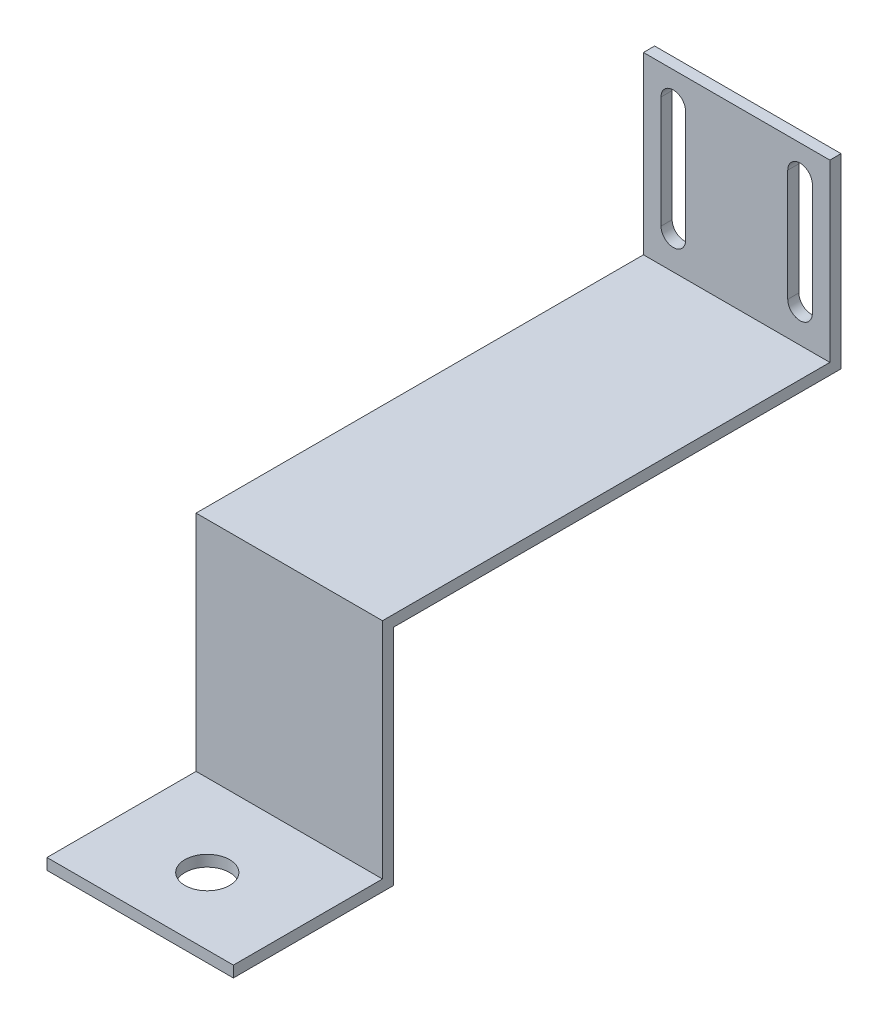
ISO-10303-21;
HEADER;
FILE_DESCRIPTION(('STEP AP214'),'2;1');
FILE_NAME('part.step','',(''),(''),'','','');
FILE_SCHEMA(('AUTOMOTIVE_DESIGN { 1 0 10303 214 1 1 1 1 }'));
ENDSEC;
DATA;
#1=APPLICATION_CONTEXT('core data for automotive mechanical design processes');
#2=APPLICATION_PROTOCOL_DEFINITION('international standard','automotive_design',2000,#1);
#3=PRODUCT_CONTEXT('',#1,'mechanical');
#4=PRODUCT('Part','Part','',(#3));
#5=PRODUCT_RELATED_PRODUCT_CATEGORY('part','',(#4));
#6=PRODUCT_DEFINITION_FORMATION('','',#4);
#7=PRODUCT_DEFINITION_CONTEXT('part definition',#1,'design');
#8=PRODUCT_DEFINITION('design','',#6,#7);
#9=PRODUCT_DEFINITION_SHAPE('','',#8);
#10=(LENGTH_UNIT() NAMED_UNIT(*) SI_UNIT(.MILLI.,.METRE.));
#11=(NAMED_UNIT(*) PLANE_ANGLE_UNIT() SI_UNIT($,.RADIAN.));
#12=(NAMED_UNIT(*) SI_UNIT($,.STERADIAN.) SOLID_ANGLE_UNIT());
#13=UNCERTAINTY_MEASURE_WITH_UNIT(LENGTH_MEASURE(1.E-05),#10,'distance_accuracy_value','');
#14=(GEOMETRIC_REPRESENTATION_CONTEXT(3) GLOBAL_UNCERTAINTY_ASSIGNED_CONTEXT((#13)) GLOBAL_UNIT_ASSIGNED_CONTEXT((#10,
#11,#12)) REPRESENTATION_CONTEXT('',''));
#15=CARTESIAN_POINT('',(0.,0.,0.));
#16=DIRECTION('',(0.,0.,1.));
#17=DIRECTION('',(1.,0.,0.));
#18=AXIS2_PLACEMENT_3D('',#15,#16,#17);
#19=CARTESIAN_POINT('',(0.,0.,123.));
#20=DIRECTION('',(0.,0.,-1.));
#21=DIRECTION('',(-1.,0.,0.));
#22=AXIS2_PLACEMENT_3D('',#19,#20,#21);
#23=PLANE('',#22);
#24=DIRECTION('',(-1.,0.,0.));
#25=VECTOR('',#24,1.);
#26=CARTESIAN_POINT('',(-25.,-82.,123.));
#27=LINE('',#26,#25);
#28=CARTESIAN_POINT('',(25.,-82.,123.));
#29=VERTEX_POINT('',#28);
#30=CARTESIAN_POINT('',(-25.,-82.,123.));
#31=VERTEX_POINT('',#30);
#32=EDGE_CURVE('E219',#29,#31,#27,.T.);
#33=ORIENTED_EDGE('',*,*,#32,.F.);
#34=DIRECTION('',(0.,1.,0.));
#35=VECTOR('',#34,1.);
#36=CARTESIAN_POINT('',(25.,-25.,123.));
#37=LINE('',#36,#35);
#38=CARTESIAN_POINT('',(25.,-22.,123.));
#39=VERTEX_POINT('',#38);
#40=EDGE_CURVE('E239',#29,#39,#37,.T.);
#41=ORIENTED_EDGE('',*,*,#40,.T.);
#42=DIRECTION('',(-1.,0.,0.));
#43=VECTOR('',#42,1.);
#44=CARTESIAN_POINT('',(-25.,-22.,123.));
#45=LINE('',#44,#43);
#46=CARTESIAN_POINT('',(-25.,-22.,123.));
#47=VERTEX_POINT('',#46);
#48=EDGE_CURVE('E356',#39,#47,#45,.T.);
#49=ORIENTED_EDGE('',*,*,#48,.T.);
#50=DIRECTION('',(0.,-1.,0.));
#51=VECTOR('',#50,1.);
#52=CARTESIAN_POINT('',(-25.,-25.,123.));
#53=LINE('',#52,#51);
#54=EDGE_CURVE('E274',#47,#31,#53,.T.);
#55=ORIENTED_EDGE('',*,*,#54,.T.);
#56=EDGE_LOOP('',(#33,#41,#49,#55));
#57=FACE_BOUND('',#56,.T.);
#58=ADVANCED_FACE('F17',(#57),#23,.F.);
#59=CARTESIAN_POINT('',(-25.,-25.,3.));
#60=DIRECTION('',(0.,1.,0.));
#61=DIRECTION('',(0.,0.,1.));
#62=AXIS2_PLACEMENT_3D('',#59,#60,#61);
#63=PLANE('',#62);
#64=DIRECTION('',(1.,0.,0.));
#65=VECTOR('',#64,1.);
#66=CARTESIAN_POINT('',(-25.,-25.,120.));
#67=LINE('',#66,#65);
#68=CARTESIAN_POINT('',(-25.,-25.,120.));
#69=VERTEX_POINT('',#68);
#70=CARTESIAN_POINT('',(25.,-25.,120.));
#71=VERTEX_POINT('',#70);
#72=EDGE_CURVE('E247',#69,#71,#67,.T.);
#73=ORIENTED_EDGE('',*,*,#72,.F.);
#74=DIRECTION('',(0.,0.,-1.));
#75=VECTOR('',#74,1.);
#76=CARTESIAN_POINT('',(-25.,-25.,3.));
#77=LINE('',#76,#75);
#78=CARTESIAN_POINT('',(-25.,-25.,0.));
#79=VERTEX_POINT('',#78);
#80=EDGE_CURVE('E262',#69,#79,#77,.T.);
#81=ORIENTED_EDGE('',*,*,#80,.T.);
#82=DIRECTION('',(1.,0.,0.));
#83=VECTOR('',#82,1.);
#84=CARTESIAN_POINT('',(-25.,-25.,0.));
#85=LINE('',#84,#83);
#86=CARTESIAN_POINT('',(25.,-25.,0.));
#87=VERTEX_POINT('',#86);
#88=EDGE_CURVE('E319',#79,#87,#85,.T.);
#89=ORIENTED_EDGE('',*,*,#88,.T.);
#90=DIRECTION('',(0.,0.,-1.));
#91=VECTOR('',#90,1.);
#92=CARTESIAN_POINT('',(25.,-25.,3.));
#93=LINE('',#92,#91);
#94=EDGE_CURVE('E308',#71,#87,#93,.T.);
#95=ORIENTED_EDGE('',*,*,#94,.F.);
#96=EDGE_LOOP('',(#73,#81,#89,#95));
#97=FACE_BOUND('',#96,.T.);
#98=ADVANCED_FACE('F337',(#97),#63,.F.);
#99=CARTESIAN_POINT('',(0.,0.,3.));
#100=DIRECTION('',(0.,0.,-1.));
#101=DIRECTION('',(-1.,0.,0.));
#102=AXIS2_PLACEMENT_3D('',#99,#100,#101);
#103=PLANE('',#102);
#104=DIRECTION('',(0.,1.,0.));
#105=VECTOR('',#104,1.);
#106=CARTESIAN_POINT('',(-20.3,0.,3.));
#107=LINE('',#106,#105);
#108=CARTESIAN_POINT('',(-20.3,-13.,3.));
#109=VERTEX_POINT('',#108);
#110=CARTESIAN_POINT('',(-20.3,17.,3.));
#111=VERTEX_POINT('',#110);
#112=EDGE_CURVE('E175',#109,#111,#107,.T.);
#113=ORIENTED_EDGE('',*,*,#112,.T.);
#114=CARTESIAN_POINT('',(-17.,17.,3.));
#115=DIRECTION('',(0.,0.,-1.));
#116=DIRECTION('',(-1.,0.,0.));
#117=AXIS2_PLACEMENT_3D('',#114,#115,#116);
#118=CIRCLE('',#117,3.3);
#119=CARTESIAN_POINT('',(-13.7,17.,3.));
#120=VERTEX_POINT('',#119);
#121=EDGE_CURVE('E178',#111,#120,#118,.T.);
#122=ORIENTED_EDGE('',*,*,#121,.T.);
#123=DIRECTION('',(0.,-1.,0.));
#124=VECTOR('',#123,1.);
#125=CARTESIAN_POINT('',(-13.7,0.,3.));
#126=LINE('',#125,#124);
#127=CARTESIAN_POINT('',(-13.7,-13.,3.));
#128=VERTEX_POINT('',#127);
#129=EDGE_CURVE('E170',#120,#128,#126,.T.);
#130=ORIENTED_EDGE('',*,*,#129,.T.);
#131=CARTESIAN_POINT('',(-17.,-13.,3.));
#132=DIRECTION('',(0.,0.,-1.));
#133=DIRECTION('',(-1.,0.,0.));
#134=AXIS2_PLACEMENT_3D('',#131,#132,#133);
#135=CIRCLE('',#134,3.3);
#136=EDGE_CURVE('E150',#128,#109,#135,.T.);
#137=ORIENTED_EDGE('',*,*,#136,.T.);
#138=EDGE_LOOP('',(#113,#122,#130,#137));
#139=FACE_BOUND('',#138,.T.);
#140=DIRECTION('',(0.,1.,0.));
#141=VECTOR('',#140,1.);
#142=CARTESIAN_POINT('',(13.7,0.,3.));
#143=LINE('',#142,#141);
#144=CARTESIAN_POINT('',(13.7,-13.,3.));
#145=VERTEX_POINT('',#144);
#146=CARTESIAN_POINT('',(13.7,17.,3.));
#147=VERTEX_POINT('',#146);
#148=EDGE_CURVE('E207',#145,#147,#143,.T.);
#149=ORIENTED_EDGE('',*,*,#148,.T.);
#150=CARTESIAN_POINT('',(17.,17.,3.));
#151=DIRECTION('',(0.,0.,-1.));
#152=DIRECTION('',(-1.,0.,0.));
#153=AXIS2_PLACEMENT_3D('',#150,#151,#152);
#154=CIRCLE('',#153,3.3);
#155=CARTESIAN_POINT('',(20.3,17.,3.));
#156=VERTEX_POINT('',#155);
#157=EDGE_CURVE('E210',#147,#156,#154,.T.);
#158=ORIENTED_EDGE('',*,*,#157,.T.);
#159=DIRECTION('',(0.,-1.,0.));
#160=VECTOR('',#159,1.);
#161=CARTESIAN_POINT('',(20.3,0.,3.));
#162=LINE('',#161,#160);
#163=CARTESIAN_POINT('',(20.3,-13.,3.));
#164=VERTEX_POINT('',#163);
#165=EDGE_CURVE('E195',#156,#164,#162,.T.);
#166=ORIENTED_EDGE('',*,*,#165,.T.);
#167=CARTESIAN_POINT('',(17.,-13.,3.));
#168=DIRECTION('',(0.,0.,-1.));
#169=DIRECTION('',(-1.,0.,0.));
#170=AXIS2_PLACEMENT_3D('',#167,#168,#169);
#171=CIRCLE('',#170,3.3);
#172=EDGE_CURVE('E204',#164,#145,#171,.T.);
#173=ORIENTED_EDGE('',*,*,#172,.T.);
#174=EDGE_LOOP('',(#149,#158,#166,#173));
#175=FACE_BOUND('',#174,.T.);
#176=DIRECTION('',(-1.,0.,0.));
#177=VECTOR('',#176,1.);
#178=CARTESIAN_POINT('',(-25.,-22.,3.));
#179=LINE('',#178,#177);
#180=CARTESIAN_POINT('',(25.,-22.,3.));
#181=VERTEX_POINT('',#180);
#182=CARTESIAN_POINT('',(-25.,-22.,3.));
#183=VERTEX_POINT('',#182);
#184=EDGE_CURVE('E276',#181,#183,#179,.T.);
#185=ORIENTED_EDGE('',*,*,#184,.F.);
#186=DIRECTION('',(0.,1.,0.));
#187=VECTOR('',#186,1.);
#188=CARTESIAN_POINT('',(25.,-25.,3.));
#189=LINE('',#188,#187);
#190=CARTESIAN_POINT('',(25.,25.,3.));
#191=VERTEX_POINT('',#190);
#192=EDGE_CURVE('E323',#181,#191,#189,.T.);
#193=ORIENTED_EDGE('',*,*,#192,.T.);
#194=DIRECTION('',(-1.,0.,0.));
#195=VECTOR('',#194,1.);
#196=CARTESIAN_POINT('',(-25.,25.,3.));
#197=LINE('',#196,#195);
#198=CARTESIAN_POINT('',(-25.,25.,3.));
#199=VERTEX_POINT('',#198);
#200=EDGE_CURVE('E311',#191,#199,#197,.T.);
#201=ORIENTED_EDGE('',*,*,#200,.T.);
#202=DIRECTION('',(0.,-1.,0.));
#203=VECTOR('',#202,1.);
#204=CARTESIAN_POINT('',(-25.,-25.,3.));
#205=LINE('',#204,#203);
#206=EDGE_CURVE('E310',#199,#183,#205,.T.);
#207=ORIENTED_EDGE('',*,*,#206,.T.);
#208=EDGE_LOOP('',(#185,#193,#201,#207));
#209=FACE_BOUND('',#208,.T.);
#210=ADVANCED_FACE('F349',(#139,#175,#209),#103,.F.);
#211=CARTESIAN_POINT('',(25.,-25.,3.));
#212=DIRECTION('',(-1.,0.,0.));
#213=DIRECTION('',(0.,0.,1.));
#214=AXIS2_PLACEMENT_3D('',#211,#212,#213);
#215=PLANE('',#214);
#216=DIRECTION('',(0.,1.,0.));
#217=VECTOR('',#216,1.);
#218=CARTESIAN_POINT('',(25.,-25.,0.));
#219=LINE('',#218,#217);
#220=CARTESIAN_POINT('',(25.,25.,0.));
#221=VERTEX_POINT('',#220);
#222=EDGE_CURVE('E332',#87,#221,#219,.T.);
#223=ORIENTED_EDGE('',*,*,#222,.T.);
#224=DIRECTION('',(0.,0.,-1.));
#225=VECTOR('',#224,1.);
#226=CARTESIAN_POINT('',(25.,25.,3.));
#227=LINE('',#226,#225);
#228=EDGE_CURVE('E11',#191,#221,#227,.T.);
#229=ORIENTED_EDGE('',*,*,#228,.F.);
#230=ORIENTED_EDGE('',*,*,#192,.F.);
#231=DIRECTION('',(0.,0.,-1.));
#232=VECTOR('',#231,1.);
#233=CARTESIAN_POINT('',(25.,-22.,123.));
#234=LINE('',#233,#232);
#235=EDGE_CURVE('E335',#39,#181,#234,.T.);
#236=ORIENTED_EDGE('',*,*,#235,.F.);
#237=ORIENTED_EDGE('',*,*,#40,.F.);
#238=DIRECTION('',(0.,0.,-1.));
#239=VECTOR('',#238,1.);
#240=CARTESIAN_POINT('',(25.,-82.,163.));
#241=LINE('',#240,#239);
#242=CARTESIAN_POINT('',(25.,-82.,163.));
#243=VERTEX_POINT('',#242);
#244=EDGE_CURVE('E244',#243,#29,#241,.T.);
#245=ORIENTED_EDGE('',*,*,#244,.F.);
#246=DIRECTION('',(0.,1.,0.));
#247=VECTOR('',#246,1.);
#248=CARTESIAN_POINT('',(25.,-85.,163.));
#249=LINE('',#248,#247);
#250=CARTESIAN_POINT('',(25.,-85.,163.));
#251=VERTEX_POINT('',#250);
#252=EDGE_CURVE('E226',#251,#243,#249,.T.);
#253=ORIENTED_EDGE('',*,*,#252,.F.);
#254=DIRECTION('',(0.,0.,1.));
#255=VECTOR('',#254,1.);
#256=CARTESIAN_POINT('',(25.,-85.,123.));
#257=LINE('',#256,#255);
#258=CARTESIAN_POINT('',(25.,-85.,120.));
#259=VERTEX_POINT('',#258);
#260=EDGE_CURVE('E270',#259,#251,#257,.T.);
#261=ORIENTED_EDGE('',*,*,#260,.F.);
#262=DIRECTION('',(0.,1.,0.));
#263=VECTOR('',#262,1.);
#264=CARTESIAN_POINT('',(25.,-85.,120.));
#265=LINE('',#264,#263);
#266=EDGE_CURVE('E265',#259,#71,#265,.T.);
#267=ORIENTED_EDGE('',*,*,#266,.T.);
#268=ORIENTED_EDGE('',*,*,#94,.T.);
#269=EDGE_LOOP('',(#223,#229,#230,#236,#237,#245,#253,#261,#267,#268));
#270=FACE_BOUND('',#269,.T.);
#271=ADVANCED_FACE('F19',(#270),#215,.F.);
#272=CARTESIAN_POINT('',(-25.,25.,3.));
#273=DIRECTION('',(0.,-1.,0.));
#274=DIRECTION('',(0.,0.,-1.));
#275=AXIS2_PLACEMENT_3D('',#272,#273,#274);
#276=PLANE('',#275);
#277=DIRECTION('',(-1.,0.,0.));
#278=VECTOR('',#277,1.);
#279=CARTESIAN_POINT('',(-25.,25.,0.));
#280=LINE('',#279,#278);
#281=CARTESIAN_POINT('',(-25.,25.,0.));
#282=VERTEX_POINT('',#281);
#283=EDGE_CURVE('E334',#221,#282,#280,.T.);
#284=ORIENTED_EDGE('',*,*,#283,.T.);
#285=DIRECTION('',(0.,0.,-1.));
#286=VECTOR('',#285,1.);
#287=CARTESIAN_POINT('',(-25.,25.,3.));
#288=LINE('',#287,#286);
#289=EDGE_CURVE('E26',#199,#282,#288,.T.);
#290=ORIENTED_EDGE('',*,*,#289,.F.);
#291=ORIENTED_EDGE('',*,*,#200,.F.);
#292=ORIENTED_EDGE('',*,*,#228,.T.);
#293=EDGE_LOOP('',(#284,#290,#291,#292));
#294=FACE_BOUND('',#293,.T.);
#295=ADVANCED_FACE('F345',(#294),#276,.F.);
#296=CARTESIAN_POINT('',(-25.,-25.,3.));
#297=DIRECTION('',(1.,0.,0.));
#298=DIRECTION('',(0.,0.,-1.));
#299=AXIS2_PLACEMENT_3D('',#296,#297,#298);
#300=PLANE('',#299);
#301=DIRECTION('',(0.,-1.,0.));
#302=VECTOR('',#301,1.);
#303=CARTESIAN_POINT('',(-25.,-25.,0.));
#304=LINE('',#303,#302);
#305=EDGE_CURVE('E304',#282,#79,#304,.T.);
#306=ORIENTED_EDGE('',*,*,#305,.T.);
#307=ORIENTED_EDGE('',*,*,#80,.F.);
#308=DIRECTION('',(0.,1.,0.));
#309=VECTOR('',#308,1.);
#310=CARTESIAN_POINT('',(-25.,-85.,120.));
#311=LINE('',#310,#309);
#312=CARTESIAN_POINT('',(-25.,-85.,120.));
#313=VERTEX_POINT('',#312);
#314=EDGE_CURVE('E279',#313,#69,#311,.T.);
#315=ORIENTED_EDGE('',*,*,#314,.F.);
#316=DIRECTION('',(0.,0.,-1.));
#317=VECTOR('',#316,1.);
#318=CARTESIAN_POINT('',(-25.,-85.,123.));
#319=LINE('',#318,#317);
#320=CARTESIAN_POINT('',(-25.,-85.,163.));
#321=VERTEX_POINT('',#320);
#322=EDGE_CURVE('E233',#321,#313,#319,.T.);
#323=ORIENTED_EDGE('',*,*,#322,.F.);
#324=DIRECTION('',(0.,-1.,0.));
#325=VECTOR('',#324,1.);
#326=CARTESIAN_POINT('',(-25.,-85.,163.));
#327=LINE('',#326,#325);
#328=CARTESIAN_POINT('',(-25.,-82.,163.));
#329=VERTEX_POINT('',#328);
#330=EDGE_CURVE('E220',#329,#321,#327,.T.);
#331=ORIENTED_EDGE('',*,*,#330,.F.);
#332=DIRECTION('',(0.,0.,-1.));
#333=VECTOR('',#332,1.);
#334=CARTESIAN_POINT('',(-25.,-82.,163.));
#335=LINE('',#334,#333);
#336=EDGE_CURVE('E230',#329,#31,#335,.T.);
#337=ORIENTED_EDGE('',*,*,#336,.T.);
#338=ORIENTED_EDGE('',*,*,#54,.F.);
#339=DIRECTION('',(0.,0.,-1.));
#340=VECTOR('',#339,1.);
#341=CARTESIAN_POINT('',(-25.,-22.,123.));
#342=LINE('',#341,#340);
#343=EDGE_CURVE('E355',#47,#183,#342,.T.);
#344=ORIENTED_EDGE('',*,*,#343,.T.);
#345=ORIENTED_EDGE('',*,*,#206,.F.);
#346=ORIENTED_EDGE('',*,*,#289,.T.);
#347=EDGE_LOOP('',(#306,#307,#315,#323,#331,#337,#338,#344,#345,#346));
#348=FACE_BOUND('',#347,.T.);
#349=ADVANCED_FACE('F299',(#348),#300,.F.);
#350=CARTESIAN_POINT('',(0.,0.,0.));
#351=DIRECTION('',(0.,0.,-1.));
#352=DIRECTION('',(-1.,0.,0.));
#353=AXIS2_PLACEMENT_3D('',#350,#351,#352);
#354=PLANE('',#353);
#355=CARTESIAN_POINT('',(-17.,17.,0.));
#356=DIRECTION('',(0.,0.,-1.));
#357=DIRECTION('',(-1.,0.,0.));
#358=AXIS2_PLACEMENT_3D('',#355,#356,#357);
#359=CIRCLE('',#358,3.3);
#360=CARTESIAN_POINT('',(-20.3,17.,0.));
#361=VERTEX_POINT('',#360);
#362=CARTESIAN_POINT('',(-13.7,17.,0.));
#363=VERTEX_POINT('',#362);
#364=EDGE_CURVE('E42',#361,#363,#359,.T.);
#365=ORIENTED_EDGE('',*,*,#364,.F.);
#366=DIRECTION('',(0.,1.,0.));
#367=VECTOR('',#366,1.);
#368=CARTESIAN_POINT('',(-20.3,17.,0.));
#369=LINE('',#368,#367);
#370=CARTESIAN_POINT('',(-20.3,-13.,0.));
#371=VERTEX_POINT('',#370);
#372=EDGE_CURVE('E163',#371,#361,#369,.T.);
#373=ORIENTED_EDGE('',*,*,#372,.F.);
#374=CARTESIAN_POINT('',(-17.,-13.,0.));
#375=DIRECTION('',(0.,0.,-1.));
#376=DIRECTION('',(-1.,0.,0.));
#377=AXIS2_PLACEMENT_3D('',#374,#375,#376);
#378=CIRCLE('',#377,3.3);
#379=CARTESIAN_POINT('',(-13.7,-13.,0.));
#380=VERTEX_POINT('',#379);
#381=EDGE_CURVE('E147',#380,#371,#378,.T.);
#382=ORIENTED_EDGE('',*,*,#381,.F.);
#383=DIRECTION('',(0.,-1.,0.));
#384=VECTOR('',#383,1.);
#385=CARTESIAN_POINT('',(-13.7,17.,0.));
#386=LINE('',#385,#384);
#387=EDGE_CURVE('E156',#363,#380,#386,.T.);
#388=ORIENTED_EDGE('',*,*,#387,.F.);
#389=EDGE_LOOP('',(#365,#373,#382,#388));
#390=FACE_BOUND('',#389,.T.);
#391=CARTESIAN_POINT('',(17.,17.,0.));
#392=DIRECTION('',(0.,0.,-1.));
#393=DIRECTION('',(-1.,0.,0.));
#394=AXIS2_PLACEMENT_3D('',#391,#392,#393);
#395=CIRCLE('',#394,3.3);
#396=CARTESIAN_POINT('',(13.7,17.,0.));
#397=VERTEX_POINT('',#396);
#398=CARTESIAN_POINT('',(20.3,17.,0.));
#399=VERTEX_POINT('',#398);
#400=EDGE_CURVE('E181',#397,#399,#395,.T.);
#401=ORIENTED_EDGE('',*,*,#400,.F.);
#402=DIRECTION('',(0.,1.,0.));
#403=VECTOR('',#402,1.);
#404=CARTESIAN_POINT('',(13.7,17.,0.));
#405=LINE('',#404,#403);
#406=CARTESIAN_POINT('',(13.7,-13.,0.));
#407=VERTEX_POINT('',#406);
#408=EDGE_CURVE('E189',#407,#397,#405,.T.);
#409=ORIENTED_EDGE('',*,*,#408,.F.);
#410=CARTESIAN_POINT('',(17.,-13.,0.));
#411=DIRECTION('',(0.,0.,-1.));
#412=DIRECTION('',(-1.,0.,0.));
#413=AXIS2_PLACEMENT_3D('',#410,#411,#412);
#414=CIRCLE('',#413,3.3);
#415=CARTESIAN_POINT('',(20.3,-13.,0.));
#416=VERTEX_POINT('',#415);
#417=EDGE_CURVE('E186',#416,#407,#414,.T.);
#418=ORIENTED_EDGE('',*,*,#417,.F.);
#419=DIRECTION('',(0.,-1.,0.));
#420=VECTOR('',#419,1.);
#421=CARTESIAN_POINT('',(20.3,17.,0.));
#422=LINE('',#421,#420);
#423=EDGE_CURVE('E183',#399,#416,#422,.T.);
#424=ORIENTED_EDGE('',*,*,#423,.F.);
#425=EDGE_LOOP('',(#401,#409,#418,#424));
#426=FACE_BOUND('',#425,.T.);
#427=ORIENTED_EDGE('',*,*,#222,.F.);
#428=ORIENTED_EDGE('',*,*,#88,.F.);
#429=ORIENTED_EDGE('',*,*,#305,.F.);
#430=ORIENTED_EDGE('',*,*,#283,.F.);
#431=EDGE_LOOP('',(#427,#428,#429,#430));
#432=FACE_BOUND('',#431,.T.);
#433=ADVANCED_FACE('F160',(#390,#426,#432),#354,.T.);
#434=CARTESIAN_POINT('',(-25.,-22.,123.));
#435=DIRECTION('',(0.,-1.,0.));
#436=DIRECTION('',(0.,0.,-1.));
#437=AXIS2_PLACEMENT_3D('',#434,#435,#436);
#438=PLANE('',#437);
#439=ORIENTED_EDGE('',*,*,#184,.T.);
#440=ORIENTED_EDGE('',*,*,#343,.F.);
#441=ORIENTED_EDGE('',*,*,#48,.F.);
#442=ORIENTED_EDGE('',*,*,#235,.T.);
#443=EDGE_LOOP('',(#439,#440,#441,#442));
#444=FACE_BOUND('',#443,.T.);
#445=ADVANCED_FACE('F353',(#444),#438,.F.);
#446=CARTESIAN_POINT('',(-25.,-85.,120.));
#447=DIRECTION('',(0.,0.,1.));
#448=DIRECTION('',(1.,0.,0.));
#449=AXIS2_PLACEMENT_3D('',#446,#447,#448);
#450=PLANE('',#449);
#451=ORIENTED_EDGE('',*,*,#72,.T.);
#452=ORIENTED_EDGE('',*,*,#266,.F.);
#453=DIRECTION('',(1.,0.,0.));
#454=VECTOR('',#453,1.);
#455=CARTESIAN_POINT('',(-25.,-85.,120.));
#456=LINE('',#455,#454);
#457=EDGE_CURVE('E258',#313,#259,#456,.T.);
#458=ORIENTED_EDGE('',*,*,#457,.F.);
#459=ORIENTED_EDGE('',*,*,#314,.T.);
#460=EDGE_LOOP('',(#451,#452,#458,#459));
#461=FACE_BOUND('',#460,.T.);
#462=ADVANCED_FACE('F289',(#461),#450,.F.);
#463=CARTESIAN_POINT('',(0.,-85.,0.));
#464=DIRECTION('',(0.,-1.,0.));
#465=DIRECTION('',(0.,0.,-1.));
#466=AXIS2_PLACEMENT_3D('',#463,#464,#465);
#467=PLANE('',#466);
#468=CARTESIAN_POINT('',(0.,-85.,145.));
#469=DIRECTION('',(0.,-1.,0.));
#470=DIRECTION('',(0.,0.,-1.));
#471=AXIS2_PLACEMENT_3D('',#468,#469,#470);
#472=CIRCLE('',#471,6.);
#473=CARTESIAN_POINT('',(0.,-85.,139.));
#474=VERTEX_POINT('',#473);
#475=EDGE_CURVE('E213',#474,#474,#472,.T.);
#476=ORIENTED_EDGE('',*,*,#475,.F.);
#477=EDGE_LOOP('',(#476));
#478=FACE_BOUND('',#477,.T.);
#479=ORIENTED_EDGE('',*,*,#322,.T.);
#480=ORIENTED_EDGE('',*,*,#457,.T.);
#481=ORIENTED_EDGE('',*,*,#260,.T.);
#482=DIRECTION('',(1.,0.,0.));
#483=VECTOR('',#482,1.);
#484=CARTESIAN_POINT('',(-25.,-85.,163.));
#485=LINE('',#484,#483);
#486=EDGE_CURVE('E223',#321,#251,#485,.T.);
#487=ORIENTED_EDGE('',*,*,#486,.F.);
#488=EDGE_LOOP('',(#479,#480,#481,#487));
#489=FACE_BOUND('',#488,.T.);
#490=ADVANCED_FACE('F288',(#478,#489),#467,.T.);
#491=CARTESIAN_POINT('',(-25.,-82.,163.));
#492=DIRECTION('',(0.,-1.,0.));
#493=DIRECTION('',(0.,0.,-1.));
#494=AXIS2_PLACEMENT_3D('',#491,#492,#493);
#495=PLANE('',#494);
#496=CARTESIAN_POINT('',(0.,-82.,145.));
#497=DIRECTION('',(0.,-1.,0.));
#498=DIRECTION('',(0.,0.,-1.));
#499=AXIS2_PLACEMENT_3D('',#496,#497,#498);
#500=CIRCLE('',#499,6.);
#501=CARTESIAN_POINT('',(0.,-82.,139.));
#502=VERTEX_POINT('',#501);
#503=EDGE_CURVE('E216',#502,#502,#500,.T.);
#504=ORIENTED_EDGE('',*,*,#503,.T.);
#505=EDGE_LOOP('',(#504));
#506=FACE_BOUND('',#505,.T.);
#507=ORIENTED_EDGE('',*,*,#32,.T.);
#508=ORIENTED_EDGE('',*,*,#336,.F.);
#509=DIRECTION('',(-1.,0.,0.));
#510=VECTOR('',#509,1.);
#511=CARTESIAN_POINT('',(-25.,-82.,163.));
#512=LINE('',#511,#510);
#513=EDGE_CURVE('E228',#243,#329,#512,.T.);
#514=ORIENTED_EDGE('',*,*,#513,.F.);
#515=ORIENTED_EDGE('',*,*,#244,.T.);
#516=EDGE_LOOP('',(#507,#508,#514,#515));
#517=FACE_BOUND('',#516,.T.);
#518=ADVANCED_FACE('F361',(#506,#517),#495,.F.);
#519=CARTESIAN_POINT('',(0.,0.,163.));
#520=DIRECTION('',(0.,0.,-1.));
#521=DIRECTION('',(-1.,0.,0.));
#522=AXIS2_PLACEMENT_3D('',#519,#520,#521);
#523=PLANE('',#522);
#524=ORIENTED_EDGE('',*,*,#330,.T.);
#525=ORIENTED_EDGE('',*,*,#486,.T.);
#526=ORIENTED_EDGE('',*,*,#252,.T.);
#527=ORIENTED_EDGE('',*,*,#513,.T.);
#528=EDGE_LOOP('',(#524,#525,#526,#527));
#529=FACE_BOUND('',#528,.T.);
#530=ADVANCED_FACE('F294',(#529),#523,.F.);
#531=CARTESIAN_POINT('',(0.,-85.,145.));
#532=DIRECTION('',(0.,-1.,0.));
#533=DIRECTION('',(0.,0.,-1.));
#534=AXIS2_PLACEMENT_3D('',#531,#532,#533);
#535=CYLINDRICAL_SURFACE('',#534,6.);
#536=ORIENTED_EDGE('',*,*,#475,.T.);
#537=EDGE_LOOP('',(#536));
#538=FACE_BOUND('',#537,.T.);
#539=ORIENTED_EDGE('',*,*,#503,.F.);
#540=EDGE_LOOP('',(#539));
#541=FACE_BOUND('',#540,.T.);
#542=ADVANCED_FACE('F371',(#538,#541),#535,.F.);
#543=CARTESIAN_POINT('',(17.,17.,163.000025));
#544=DIRECTION('',(0.,0.,-1.));
#545=DIRECTION('',(-1.,0.,0.));
#546=AXIS2_PLACEMENT_3D('',#543,#544,#545);
#547=CYLINDRICAL_SURFACE('',#546,3.3);
#548=DIRECTION('',(0.,0.,-1.));
#549=VECTOR('',#548,1.);
#550=CARTESIAN_POINT('',(13.7,17.,163.000025));
#551=LINE('',#550,#549);
#552=EDGE_CURVE('E193',#147,#397,#551,.T.);
#553=ORIENTED_EDGE('',*,*,#552,.T.);
#554=ORIENTED_EDGE('',*,*,#400,.T.);
#555=DIRECTION('',(0.,0.,-1.));
#556=VECTOR('',#555,1.);
#557=CARTESIAN_POINT('',(20.3,17.,163.000025));
#558=LINE('',#557,#556);
#559=EDGE_CURVE('E192',#156,#399,#558,.T.);
#560=ORIENTED_EDGE('',*,*,#559,.F.);
#561=ORIENTED_EDGE('',*,*,#157,.F.);
#562=EDGE_LOOP('',(#553,#554,#560,#561));
#563=FACE_BOUND('',#562,.T.);
#564=ADVANCED_FACE('F444',(#563),#547,.F.);
#565=CARTESIAN_POINT('',(13.7,17.,163.000025));
#566=DIRECTION('',(-1.,0.,0.));
#567=DIRECTION('',(0.,-1.,0.));
#568=AXIS2_PLACEMENT_3D('',#565,#566,#567);
#569=PLANE('',#568);
#570=DIRECTION('',(0.,0.,-1.));
#571=VECTOR('',#570,1.);
#572=CARTESIAN_POINT('',(13.7,-13.,163.000025));
#573=LINE('',#572,#571);
#574=EDGE_CURVE('E196',#145,#407,#573,.T.);
#575=ORIENTED_EDGE('',*,*,#574,.T.);
#576=ORIENTED_EDGE('',*,*,#408,.T.);
#577=ORIENTED_EDGE('',*,*,#552,.F.);
#578=ORIENTED_EDGE('',*,*,#148,.F.);
#579=EDGE_LOOP('',(#575,#576,#577,#578));
#580=FACE_BOUND('',#579,.T.);
#581=ADVANCED_FACE('F455',(#580),#569,.F.);
#582=CARTESIAN_POINT('',(17.,-13.,163.000025));
#583=DIRECTION('',(0.,0.,-1.));
#584=DIRECTION('',(-1.,0.,0.));
#585=AXIS2_PLACEMENT_3D('',#582,#583,#584);
#586=CYLINDRICAL_SURFACE('',#585,3.3);
#587=DIRECTION('',(0.,0.,-1.));
#588=VECTOR('',#587,1.);
#589=CARTESIAN_POINT('',(20.3,-13.,163.000025));
#590=LINE('',#589,#588);
#591=EDGE_CURVE('E198',#164,#416,#590,.T.);
#592=ORIENTED_EDGE('',*,*,#591,.T.);
#593=ORIENTED_EDGE('',*,*,#417,.T.);
#594=ORIENTED_EDGE('',*,*,#574,.F.);
#595=ORIENTED_EDGE('',*,*,#172,.F.);
#596=EDGE_LOOP('',(#592,#593,#594,#595));
#597=FACE_BOUND('',#596,.T.);
#598=ADVANCED_FACE('F465',(#597),#586,.F.);
#599=CARTESIAN_POINT('',(20.3,17.,163.000025));
#600=DIRECTION('',(1.,0.,0.));
#601=DIRECTION('',(0.,1.,0.));
#602=AXIS2_PLACEMENT_3D('',#599,#600,#601);
#603=PLANE('',#602);
#604=ORIENTED_EDGE('',*,*,#559,.T.);
#605=ORIENTED_EDGE('',*,*,#423,.T.);
#606=ORIENTED_EDGE('',*,*,#591,.F.);
#607=ORIENTED_EDGE('',*,*,#165,.F.);
#608=EDGE_LOOP('',(#604,#605,#606,#607));
#609=FACE_BOUND('',#608,.T.);
#610=ADVANCED_FACE('F475',(#609),#603,.F.);
#611=CARTESIAN_POINT('',(-17.,17.,163.000025));
#612=DIRECTION('',(0.,0.,-1.));
#613=DIRECTION('',(-1.,0.,0.));
#614=AXIS2_PLACEMENT_3D('',#611,#612,#613);
#615=CYLINDRICAL_SURFACE('',#614,3.3);
#616=DIRECTION('',(0.,0.,-1.));
#617=VECTOR('',#616,1.);
#618=CARTESIAN_POINT('',(-20.3,17.,163.000025));
#619=LINE('',#618,#617);
#620=EDGE_CURVE('E168',#111,#361,#619,.T.);
#621=ORIENTED_EDGE('',*,*,#620,.T.);
#622=ORIENTED_EDGE('',*,*,#364,.T.);
#623=DIRECTION('',(0.,0.,-1.));
#624=VECTOR('',#623,1.);
#625=CARTESIAN_POINT('',(-13.7,17.,163.000025));
#626=LINE('',#625,#624);
#627=EDGE_CURVE('E153',#120,#363,#626,.T.);
#628=ORIENTED_EDGE('',*,*,#627,.F.);
#629=ORIENTED_EDGE('',*,*,#121,.F.);
#630=EDGE_LOOP('',(#621,#622,#628,#629));
#631=FACE_BOUND('',#630,.T.);
#632=ADVANCED_FACE('F485',(#631),#615,.F.);
#633=CARTESIAN_POINT('',(-20.3,17.,163.000025));
#634=DIRECTION('',(-1.,0.,0.));
#635=DIRECTION('',(0.,0.,1.));
#636=AXIS2_PLACEMENT_3D('',#633,#634,#635);
#637=PLANE('',#636);
#638=DIRECTION('',(0.,0.,-1.));
#639=VECTOR('',#638,1.);
#640=CARTESIAN_POINT('',(-20.3,-13.,163.000025));
#641=LINE('',#640,#639);
#642=EDGE_CURVE('E152',#109,#371,#641,.T.);
#643=ORIENTED_EDGE('',*,*,#642,.T.);
#644=ORIENTED_EDGE('',*,*,#372,.T.);
#645=ORIENTED_EDGE('',*,*,#620,.F.);
#646=ORIENTED_EDGE('',*,*,#112,.F.);
#647=EDGE_LOOP('',(#643,#644,#645,#646));
#648=FACE_BOUND('',#647,.T.);
#649=ADVANCED_FACE('F495',(#648),#637,.F.);
#650=CARTESIAN_POINT('',(-17.,-13.,163.000025));
#651=DIRECTION('',(0.,0.,-1.));
#652=DIRECTION('',(-1.,0.,0.));
#653=AXIS2_PLACEMENT_3D('',#650,#651,#652);
#654=CYLINDRICAL_SURFACE('',#653,3.3);
#655=DIRECTION('',(0.,0.,-1.));
#656=VECTOR('',#655,1.);
#657=CARTESIAN_POINT('',(-13.7,-13.,163.000025));
#658=LINE('',#657,#656);
#659=EDGE_CURVE('E34',#128,#380,#658,.T.);
#660=ORIENTED_EDGE('',*,*,#659,.T.);
#661=ORIENTED_EDGE('',*,*,#381,.T.);
#662=ORIENTED_EDGE('',*,*,#642,.F.);
#663=ORIENTED_EDGE('',*,*,#136,.F.);
#664=EDGE_LOOP('',(#660,#661,#662,#663));
#665=FACE_BOUND('',#664,.T.);
#666=ADVANCED_FACE('F144',(#665),#654,.F.);
#667=CARTESIAN_POINT('',(-13.7,17.,163.000025));
#668=DIRECTION('',(1.,0.,0.));
#669=DIRECTION('',(0.,1.,0.));
#670=AXIS2_PLACEMENT_3D('',#667,#668,#669);
#671=PLANE('',#670);
#672=ORIENTED_EDGE('',*,*,#627,.T.);
#673=ORIENTED_EDGE('',*,*,#387,.T.);
#674=ORIENTED_EDGE('',*,*,#659,.F.);
#675=ORIENTED_EDGE('',*,*,#129,.F.);
#676=EDGE_LOOP('',(#672,#673,#674,#675));
#677=FACE_BOUND('',#676,.T.);
#678=ADVANCED_FACE('F157',(#677),#671,.F.);
#679=CLOSED_SHELL('',(#58,#98,#210,#271,#295,#349,#433,#445,#462,#490,#518,#530,#542,#564,#581,
#598,#610,#632,#649,#666,#678));
#680=MANIFOLD_SOLID_BREP('B1',#679);
#681=ADVANCED_BREP_SHAPE_REPRESENTATION('',(#18,#680),#14);
#682=SHAPE_DEFINITION_REPRESENTATION(#9,#681);
ENDSEC;
END-ISO-10303-21;
